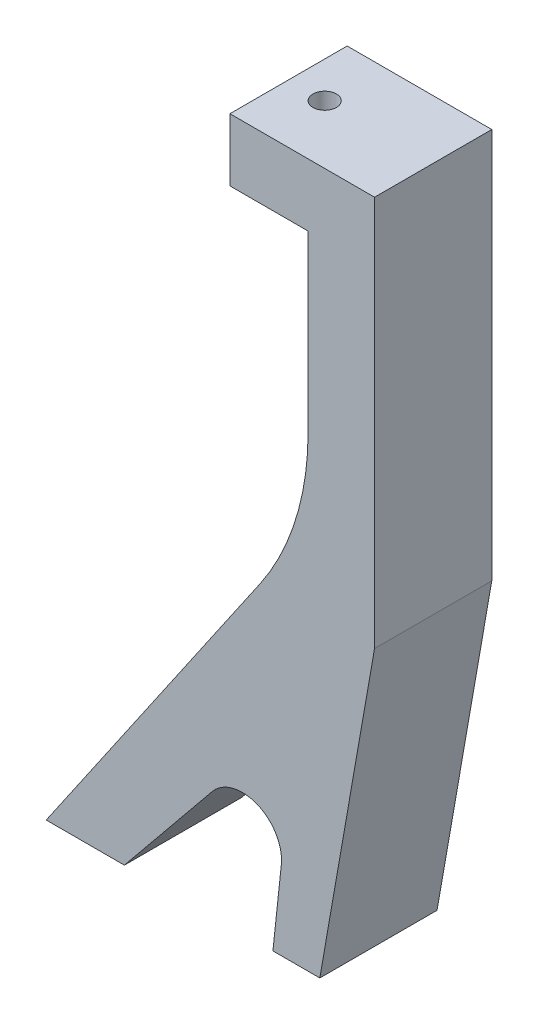
ISO-10303-21;
HEADER;
FILE_DESCRIPTION(('STEP AP214'),'2;1');
FILE_NAME('part.step','',(''),(''),'','','');
FILE_SCHEMA(('AUTOMOTIVE_DESIGN { 1 0 10303 214 1 1 1 1 }'));
ENDSEC;
DATA;
#1=APPLICATION_CONTEXT('core data for automotive mechanical design processes');
#2=APPLICATION_PROTOCOL_DEFINITION('international standard','automotive_design',2000,#1);
#3=PRODUCT_CONTEXT('',#1,'mechanical');
#4=PRODUCT('Part','Part','',(#3));
#5=PRODUCT_RELATED_PRODUCT_CATEGORY('part','',(#4));
#6=PRODUCT_DEFINITION_FORMATION('','',#4);
#7=PRODUCT_DEFINITION_CONTEXT('part definition',#1,'design');
#8=PRODUCT_DEFINITION('design','',#6,#7);
#9=PRODUCT_DEFINITION_SHAPE('','',#8);
#10=(LENGTH_UNIT() NAMED_UNIT(*) SI_UNIT(.MILLI.,.METRE.));
#11=(NAMED_UNIT(*) PLANE_ANGLE_UNIT() SI_UNIT($,.RADIAN.));
#12=(NAMED_UNIT(*) SI_UNIT($,.STERADIAN.) SOLID_ANGLE_UNIT());
#13=UNCERTAINTY_MEASURE_WITH_UNIT(LENGTH_MEASURE(1.E-05),#10,'distance_accuracy_value','');
#14=(GEOMETRIC_REPRESENTATION_CONTEXT(3) GLOBAL_UNCERTAINTY_ASSIGNED_CONTEXT((#13)) GLOBAL_UNIT_ASSIGNED_CONTEXT((#10,
#11,#12)) REPRESENTATION_CONTEXT('',''));
#15=CARTESIAN_POINT('',(0.,0.,0.));
#16=DIRECTION('',(0.,0.,1.));
#17=DIRECTION('',(1.,0.,0.));
#18=AXIS2_PLACEMENT_3D('',#15,#16,#17);
#19=CARTESIAN_POINT('',(-6.5,0.,15.));
#20=DIRECTION('',(1.,0.,0.));
#21=DIRECTION('',(0.,1.,0.));
#22=AXIS2_PLACEMENT_3D('',#19,#20,#21);
#23=PLANE('',#22);
#24=DIRECTION('',(0.,-1.,0.));
#25=VECTOR('',#24,1.);
#26=CARTESIAN_POINT('',(-6.5,0.,0.));
#27=LINE('',#26,#25);
#28=CARTESIAN_POINT('',(-6.5,42.,0.));
#29=VERTEX_POINT('',#28);
#30=CARTESIAN_POINT('',(-6.5,19.6635846093978,0.));
#31=VERTEX_POINT('',#30);
#32=EDGE_CURVE('E161',#29,#31,#27,.T.);
#33=ORIENTED_EDGE('',*,*,#32,.T.);
#34=DIRECTION('',(0.,0.,-1.));
#35=VECTOR('',#34,1.);
#36=CARTESIAN_POINT('',(-6.5,19.6635846093978,15.));
#37=LINE('',#36,#35);
#38=CARTESIAN_POINT('',(-6.5,19.6635846093978,15.));
#39=VERTEX_POINT('',#38);
#40=EDGE_CURVE('E11',#39,#31,#37,.T.);
#41=ORIENTED_EDGE('',*,*,#40,.F.);
#42=DIRECTION('',(0.,-1.,0.));
#43=VECTOR('',#42,1.);
#44=CARTESIAN_POINT('',(-6.5,0.,15.));
#45=LINE('',#44,#43);
#46=CARTESIAN_POINT('',(-6.5,42.,15.));
#47=VERTEX_POINT('',#46);
#48=EDGE_CURVE('E189',#47,#39,#45,.T.);
#49=ORIENTED_EDGE('',*,*,#48,.F.);
#50=DIRECTION('',(0.,0.,-1.));
#51=VECTOR('',#50,1.);
#52=CARTESIAN_POINT('',(-6.5,42.,15.));
#53=LINE('',#52,#51);
#54=EDGE_CURVE('E50',#47,#29,#53,.T.);
#55=ORIENTED_EDGE('',*,*,#54,.T.);
#56=EDGE_LOOP('',(#33,#41,#49,#55));
#57=FACE_BOUND('',#56,.T.);
#58=ADVANCED_FACE('F33',(#57),#23,.F.);
#59=CARTESIAN_POINT('',(-41.5,19.6635846093977,15.));
#60=DIRECTION('',(0.,0.,-1.));
#61=DIRECTION('',(-1.,0.,0.));
#62=AXIS2_PLACEMENT_3D('',#59,#60,#61);
#63=CYLINDRICAL_SURFACE('',#62,35.);
#64=CARTESIAN_POINT('',(-41.5,19.6635846093977,0.));
#65=DIRECTION('',(0.,0.,1.));
#66=DIRECTION('',(1.,0.,0.));
#67=AXIS2_PLACEMENT_3D('',#64,#65,#66);
#68=CIRCLE('',#67,35.);
#69=CARTESIAN_POINT('',(-12.6432773807094,-0.14271639996102,0.));
#70=VERTEX_POINT('',#69);
#71=EDGE_CURVE('E163',#31,#70,#68,.F.);
#72=ORIENTED_EDGE('',*,*,#71,.T.);
#73=DIRECTION('',(0.,0.,-1.));
#74=VECTOR('',#73,1.);
#75=CARTESIAN_POINT('',(-12.6432773807094,-0.14271639996102,15.));
#76=LINE('',#75,#74);
#77=CARTESIAN_POINT('',(-12.6432773807094,-0.14271639996102,15.));
#78=VERTEX_POINT('',#77);
#79=EDGE_CURVE('E42',#78,#70,#76,.T.);
#80=ORIENTED_EDGE('',*,*,#79,.F.);
#81=CARTESIAN_POINT('',(-41.5,19.6635846093977,15.));
#82=DIRECTION('',(0.,0.,1.));
#83=DIRECTION('',(1.,0.,0.));
#84=AXIS2_PLACEMENT_3D('',#81,#82,#83);
#85=CIRCLE('',#84,35.);
#86=EDGE_CURVE('E103',#39,#78,#85,.F.);
#87=ORIENTED_EDGE('',*,*,#86,.F.);
#88=ORIENTED_EDGE('',*,*,#40,.T.);
#89=EDGE_LOOP('',(#72,#80,#87,#88));
#90=FACE_BOUND('',#89,.T.);
#91=ADVANCED_FACE('F219',(#90),#63,.F.);
#92=CARTESIAN_POINT('',(-8.52785325666757,5.8532367238504,15.));
#93=DIRECTION('',(-0.82447778912259,0.565894314553102,0.));
#94=DIRECTION('',(-0.565894314553102,-0.82447778912259,0.));
#95=AXIS2_PLACEMENT_3D('',#92,#93,#94);
#96=PLANE('',#95);
#97=DIRECTION('',(0.565894314553102,0.824477789122591,0.));
#98=VECTOR('',#97,1.);
#99=CARTESIAN_POINT('',(-8.52785325666757,5.8532367238504,0.));
#100=LINE('',#99,#98);
#101=CARTESIAN_POINT('',(-40.,-40.,0.));
#102=VERTEX_POINT('',#101);
#103=EDGE_CURVE('E166',#102,#70,#100,.T.);
#104=ORIENTED_EDGE('',*,*,#103,.F.);
#105=DIRECTION('',(0.,0.,-1.));
#106=VECTOR('',#105,1.);
#107=CARTESIAN_POINT('',(-40.,-40.,15.));
#108=LINE('',#107,#106);
#109=CARTESIAN_POINT('',(-40.,-40.,15.));
#110=VERTEX_POINT('',#109);
#111=EDGE_CURVE('E211',#110,#102,#108,.T.);
#112=ORIENTED_EDGE('',*,*,#111,.F.);
#113=DIRECTION('',(0.565894314553102,0.824477789122591,0.));
#114=VECTOR('',#113,1.);
#115=CARTESIAN_POINT('',(-8.52785325666757,5.8532367238504,15.));
#116=LINE('',#115,#114);
#117=EDGE_CURVE('E218',#110,#78,#116,.T.);
#118=ORIENTED_EDGE('',*,*,#117,.T.);
#119=ORIENTED_EDGE('',*,*,#79,.T.);
#120=EDGE_LOOP('',(#104,#112,#118,#119));
#121=FACE_BOUND('',#120,.T.);
#122=ADVANCED_FACE('F216',(#121),#96,.T.);
#123=CARTESIAN_POINT('',(0.,-40.,15.));
#124=DIRECTION('',(0.,1.,0.));
#125=DIRECTION('',(0.,0.,1.));
#126=AXIS2_PLACEMENT_3D('',#123,#124,#125);
#127=PLANE('',#126);
#128=DIRECTION('',(1.,0.,0.));
#129=VECTOR('',#128,1.);
#130=CARTESIAN_POINT('',(0.,-40.,0.));
#131=LINE('',#130,#129);
#132=CARTESIAN_POINT('',(-30.,-40.,0.));
#133=VERTEX_POINT('',#132);
#134=EDGE_CURVE('E169',#102,#133,#131,.T.);
#135=ORIENTED_EDGE('',*,*,#134,.T.);
#136=DIRECTION('',(0.,0.,-1.));
#137=VECTOR('',#136,1.);
#138=CARTESIAN_POINT('',(-30.,-40.,15.));
#139=LINE('',#138,#137);
#140=CARTESIAN_POINT('',(-30.,-40.,15.));
#141=VERTEX_POINT('',#140);
#142=EDGE_CURVE('E208',#141,#133,#139,.T.);
#143=ORIENTED_EDGE('',*,*,#142,.F.);
#144=DIRECTION('',(1.,0.,0.));
#145=VECTOR('',#144,1.);
#146=CARTESIAN_POINT('',(0.,-40.,15.));
#147=LINE('',#146,#145);
#148=EDGE_CURVE('E237',#110,#141,#147,.T.);
#149=ORIENTED_EDGE('',*,*,#148,.F.);
#150=ORIENTED_EDGE('',*,*,#111,.T.);
#151=EDGE_LOOP('',(#135,#143,#149,#150));
#152=FACE_BOUND('',#151,.T.);
#153=ADVANCED_FACE('F228',(#152),#127,.F.);
#154=CARTESIAN_POINT('',(1.57446256526328,-1.28403914642141,15.));
#155=DIRECTION('',(-0.774959239492051,0.632011215981094,0.));
#156=DIRECTION('',(-0.632011215981094,-0.774959239492051,0.));
#157=AXIS2_PLACEMENT_3D('',#154,#155,#156);
#158=PLANE('',#157);
#159=DIRECTION('',(0.632011215981094,0.774959239492051,0.));
#160=VECTOR('',#159,1.);
#161=CARTESIAN_POINT('',(1.57446256526328,-1.28403914642141,0.));
#162=LINE('',#161,#160);
#163=CARTESIAN_POINT('',(-18.7725196071444,-26.2330929473259,0.));
#164=VERTEX_POINT('',#163);
#165=EDGE_CURVE('E171',#133,#164,#162,.T.);
#166=ORIENTED_EDGE('',*,*,#165,.T.);
#167=DIRECTION('',(0.,0.,-1.));
#168=VECTOR('',#167,1.);
#169=CARTESIAN_POINT('',(-18.7725196071444,-26.2330929473259,15.));
#170=LINE('',#169,#168);
#171=CARTESIAN_POINT('',(-18.7725196071444,-26.2330929473259,15.));
#172=VERTEX_POINT('',#171);
#173=EDGE_CURVE('E205',#172,#164,#170,.T.);
#174=ORIENTED_EDGE('',*,*,#173,.F.);
#175=DIRECTION('',(0.632011215981094,0.774959239492051,0.));
#176=VECTOR('',#175,1.);
#177=CARTESIAN_POINT('',(1.57446256526328,-1.28403914642141,15.));
#178=LINE('',#177,#176);
#179=EDGE_CURVE('E234',#141,#172,#178,.T.);
#180=ORIENTED_EDGE('',*,*,#179,.F.);
#181=ORIENTED_EDGE('',*,*,#142,.T.);
#182=EDGE_LOOP('',(#166,#174,#180,#181));
#183=FACE_BOUND('',#182,.T.);
#184=ADVANCED_FACE('F232',(#183),#158,.F.);
#185=CARTESIAN_POINT('',(-14.8977234096841,-29.3931490272312,15.));
#186=DIRECTION('',(0.,0.,-1.));
#187=DIRECTION('',(-1.,0.,0.));
#188=AXIS2_PLACEMENT_3D('',#185,#186,#187);
#189=CYLINDRICAL_SURFACE('',#188,5.);
#190=CARTESIAN_POINT('',(-14.8977234096841,-29.3931490272312,0.));
#191=DIRECTION('',(0.,0.,1.));
#192=DIRECTION('',(1.,0.,0.));
#193=AXIS2_PLACEMENT_3D('',#190,#191,#192);
#194=CIRCLE('',#193,5.);
#195=CARTESIAN_POINT('',(-9.925888036134,-29.9231047030347,0.));
#196=VERTEX_POINT('',#195);
#197=EDGE_CURVE('E173',#164,#196,#194,.F.);
#198=ORIENTED_EDGE('',*,*,#197,.T.);
#199=DIRECTION('',(0.,0.,-1.));
#200=VECTOR('',#199,1.);
#201=CARTESIAN_POINT('',(-9.925888036134,-29.9231047030347,15.));
#202=LINE('',#201,#200);
#203=CARTESIAN_POINT('',(-9.925888036134,-29.9231047030347,15.));
#204=VERTEX_POINT('',#203);
#205=EDGE_CURVE('E202',#204,#196,#202,.T.);
#206=ORIENTED_EDGE('',*,*,#205,.F.);
#207=CARTESIAN_POINT('',(-14.8977234096841,-29.3931490272312,15.));
#208=DIRECTION('',(0.,0.,1.));
#209=DIRECTION('',(1.,0.,0.));
#210=AXIS2_PLACEMENT_3D('',#207,#208,#209);
#211=CIRCLE('',#210,5.);
#212=EDGE_CURVE('E236',#172,#204,#211,.F.);
#213=ORIENTED_EDGE('',*,*,#212,.F.);
#214=ORIENTED_EDGE('',*,*,#173,.T.);
#215=EDGE_LOOP('',(#198,#206,#213,#214));
#216=FACE_BOUND('',#215,.T.);
#217=ADVANCED_FACE('F344',(#216),#189,.F.);
#218=CARTESIAN_POINT('',(-6.66066087134491,0.709970215858082,15.));
#219=DIRECTION('',(0.994367074710016,-0.10599113516066,0.));
#220=DIRECTION('',(0.10599113516066,0.994367074710016,0.));
#221=AXIS2_PLACEMENT_3D('',#218,#219,#220);
#222=PLANE('',#221);
#223=DIRECTION('',(-0.10599113516066,-0.994367074710016,0.));
#224=VECTOR('',#223,1.);
#225=CARTESIAN_POINT('',(-6.66066087134491,0.709970215858082,0.));
#226=LINE('',#225,#224);
#227=CARTESIAN_POINT('',(-11.,-40.,0.));
#228=VERTEX_POINT('',#227);
#229=EDGE_CURVE('E175',#196,#228,#226,.T.);
#230=ORIENTED_EDGE('',*,*,#229,.T.);
#231=DIRECTION('',(0.,0.,-1.));
#232=VECTOR('',#231,1.);
#233=CARTESIAN_POINT('',(-11.,-40.,15.));
#234=LINE('',#233,#232);
#235=CARTESIAN_POINT('',(-11.,-40.,15.));
#236=VERTEX_POINT('',#235);
#237=EDGE_CURVE('E199',#236,#228,#234,.T.);
#238=ORIENTED_EDGE('',*,*,#237,.F.);
#239=DIRECTION('',(-0.10599113516066,-0.994367074710016,0.));
#240=VECTOR('',#239,1.);
#241=CARTESIAN_POINT('',(-6.66066087134491,0.709970215858082,15.));
#242=LINE('',#241,#240);
#243=EDGE_CURVE('E239',#204,#236,#242,.T.);
#244=ORIENTED_EDGE('',*,*,#243,.F.);
#245=ORIENTED_EDGE('',*,*,#205,.T.);
#246=EDGE_LOOP('',(#230,#238,#244,#245));
#247=FACE_BOUND('',#246,.T.);
#248=ADVANCED_FACE('F334',(#247),#222,.F.);
#249=CARTESIAN_POINT('',(0.,-40.,15.));
#250=DIRECTION('',(0.,1.,0.));
#251=DIRECTION('',(-1.,0.,0.));
#252=AXIS2_PLACEMENT_3D('',#249,#250,#251);
#253=PLANE('',#252);
#254=DIRECTION('',(1.,0.,0.));
#255=VECTOR('',#254,1.);
#256=CARTESIAN_POINT('',(0.,-40.,0.));
#257=LINE('',#256,#255);
#258=CARTESIAN_POINT('',(-5.,-40.,0.));
#259=VERTEX_POINT('',#258);
#260=EDGE_CURVE('E177',#228,#259,#257,.T.);
#261=ORIENTED_EDGE('',*,*,#260,.T.);
#262=DIRECTION('',(0.,0.,-1.));
#263=VECTOR('',#262,1.);
#264=CARTESIAN_POINT('',(-5.,-40.,15.));
#265=LINE('',#264,#263);
#266=CARTESIAN_POINT('',(-5.,-40.,15.));
#267=VERTEX_POINT('',#266);
#268=EDGE_CURVE('E196',#267,#259,#265,.T.);
#269=ORIENTED_EDGE('',*,*,#268,.F.);
#270=DIRECTION('',(1.,0.,0.));
#271=VECTOR('',#270,1.);
#272=CARTESIAN_POINT('',(0.,-40.,15.));
#273=LINE('',#272,#271);
#274=EDGE_CURVE('E245',#236,#267,#273,.T.);
#275=ORIENTED_EDGE('',*,*,#274,.F.);
#276=ORIENTED_EDGE('',*,*,#237,.T.);
#277=EDGE_LOOP('',(#261,#269,#275,#276));
#278=FACE_BOUND('',#277,.T.);
#279=ADVANCED_FACE('F325',(#278),#253,.F.);
#280=CARTESIAN_POINT('',(1.94057004244997,-0.339599757428745,15.));
#281=DIRECTION('',(-0.985030467155704,0.172380331752248,0.));
#282=DIRECTION('',(-0.172380331752248,-0.985030467155704,0.));
#283=AXIS2_PLACEMENT_3D('',#280,#281,#282);
#284=PLANE('',#283);
#285=DIRECTION('',(0.172380331752248,0.985030467155704,0.));
#286=VECTOR('',#285,1.);
#287=CARTESIAN_POINT('',(1.94057004244997,-0.339599757428745,0.));
#288=LINE('',#287,#286);
#289=CARTESIAN_POINT('',(2.,0.,0.));
#290=VERTEX_POINT('',#289);
#291=EDGE_CURVE('E179',#259,#290,#288,.T.);
#292=ORIENTED_EDGE('',*,*,#291,.T.);
#293=DIRECTION('',(0.,0.,-1.));
#294=VECTOR('',#293,1.);
#295=CARTESIAN_POINT('',(2.,0.,15.));
#296=LINE('',#295,#294);
#297=CARTESIAN_POINT('',(2.,0.,15.));
#298=VERTEX_POINT('',#297);
#299=EDGE_CURVE('E193',#298,#290,#296,.T.);
#300=ORIENTED_EDGE('',*,*,#299,.F.);
#301=DIRECTION('',(0.172380331752248,0.985030467155704,0.));
#302=VECTOR('',#301,1.);
#303=CARTESIAN_POINT('',(1.94057004244997,-0.339599757428745,15.));
#304=LINE('',#303,#302);
#305=EDGE_CURVE('E247',#267,#298,#304,.T.);
#306=ORIENTED_EDGE('',*,*,#305,.F.);
#307=ORIENTED_EDGE('',*,*,#268,.T.);
#308=EDGE_LOOP('',(#292,#300,#306,#307));
#309=FACE_BOUND('',#308,.T.);
#310=ADVANCED_FACE('F253',(#309),#284,.F.);
#311=CARTESIAN_POINT('',(2.,0.,15.));
#312=DIRECTION('',(-1.,0.,0.));
#313=DIRECTION('',(0.,0.,1.));
#314=AXIS2_PLACEMENT_3D('',#311,#312,#313);
#315=PLANE('',#314);
#316=DIRECTION('',(0.,1.,0.));
#317=VECTOR('',#316,1.);
#318=CARTESIAN_POINT('',(2.,0.,0.));
#319=LINE('',#318,#317);
#320=CARTESIAN_POINT('',(2.,50.,0.));
#321=VERTEX_POINT('',#320);
#322=EDGE_CURVE('E181',#290,#321,#319,.T.);
#323=ORIENTED_EDGE('',*,*,#322,.T.);
#324=DIRECTION('',(0.,0.,-1.));
#325=VECTOR('',#324,1.);
#326=CARTESIAN_POINT('',(2.,50.,15.));
#327=LINE('',#326,#325);
#328=CARTESIAN_POINT('',(2.,50.,15.));
#329=VERTEX_POINT('',#328);
#330=EDGE_CURVE('E153',#329,#321,#327,.T.);
#331=ORIENTED_EDGE('',*,*,#330,.F.);
#332=DIRECTION('',(0.,1.,0.));
#333=VECTOR('',#332,1.);
#334=CARTESIAN_POINT('',(2.,0.,15.));
#335=LINE('',#334,#333);
#336=EDGE_CURVE('E141',#298,#329,#335,.T.);
#337=ORIENTED_EDGE('',*,*,#336,.F.);
#338=ORIENTED_EDGE('',*,*,#299,.T.);
#339=EDGE_LOOP('',(#323,#331,#337,#338));
#340=FACE_BOUND('',#339,.T.);
#341=ADVANCED_FACE('F257',(#340),#315,.F.);
#342=CARTESIAN_POINT('',(0.,50.,15.));
#343=DIRECTION('',(0.,-1.,0.));
#344=DIRECTION('',(0.,0.,-1.));
#345=AXIS2_PLACEMENT_3D('',#342,#343,#344);
#346=PLANE('',#345);
#347=CARTESIAN_POINT('',(-11.875,50.,7.5));
#348=DIRECTION('',(0.,1.,0.));
#349=DIRECTION('',(0.,0.,1.));
#350=AXIS2_PLACEMENT_3D('',#347,#348,#349);
#351=CIRCLE('',#350,1.5);
#352=CARTESIAN_POINT('',(-11.875,50.,9.));
#353=VERTEX_POINT('',#352);
#354=EDGE_CURVE('E277',#353,#353,#351,.T.);
#355=ORIENTED_EDGE('',*,*,#354,.F.);
#356=EDGE_LOOP('',(#355));
#357=FACE_BOUND('',#356,.T.);
#358=DIRECTION('',(-1.,0.,0.));
#359=VECTOR('',#358,1.);
#360=CARTESIAN_POINT('',(0.,50.,0.));
#361=LINE('',#360,#359);
#362=CARTESIAN_POINT('',(-16.5,50.,0.));
#363=VERTEX_POINT('',#362);
#364=EDGE_CURVE('E150',#321,#363,#361,.T.);
#365=ORIENTED_EDGE('',*,*,#364,.T.);
#366=DIRECTION('',(0.,0.,-1.));
#367=VECTOR('',#366,1.);
#368=CARTESIAN_POINT('',(-16.5,50.,15.));
#369=LINE('',#368,#367);
#370=CARTESIAN_POINT('',(-16.5,50.,15.));
#371=VERTEX_POINT('',#370);
#372=EDGE_CURVE('E147',#371,#363,#369,.T.);
#373=ORIENTED_EDGE('',*,*,#372,.F.);
#374=DIRECTION('',(-1.,0.,0.));
#375=VECTOR('',#374,1.);
#376=CARTESIAN_POINT('',(0.,50.,15.));
#377=LINE('',#376,#375);
#378=EDGE_CURVE('E134',#329,#371,#377,.T.);
#379=ORIENTED_EDGE('',*,*,#378,.F.);
#380=ORIENTED_EDGE('',*,*,#330,.T.);
#381=EDGE_LOOP('',(#365,#373,#379,#380));
#382=FACE_BOUND('',#381,.T.);
#383=ADVANCED_FACE('F148',(#357,#382),#346,.F.);
#384=CARTESIAN_POINT('',(-16.5,0.,15.));
#385=DIRECTION('',(-1.,0.,0.));
#386=DIRECTION('',(0.,0.,1.));
#387=AXIS2_PLACEMENT_3D('',#384,#385,#386);
#388=PLANE('',#387);
#389=DIRECTION('',(0.,1.,0.));
#390=VECTOR('',#389,1.);
#391=CARTESIAN_POINT('',(-16.5,0.,0.));
#392=LINE('',#391,#390);
#393=CARTESIAN_POINT('',(-16.5,42.,0.));
#394=VERTEX_POINT('',#393);
#395=EDGE_CURVE('E184',#394,#363,#392,.T.);
#396=ORIENTED_EDGE('',*,*,#395,.F.);
#397=DIRECTION('',(0.,0.,-1.));
#398=VECTOR('',#397,1.);
#399=CARTESIAN_POINT('',(-16.5,42.,15.));
#400=LINE('',#399,#398);
#401=CARTESIAN_POINT('',(-16.5,42.,15.));
#402=VERTEX_POINT('',#401);
#403=EDGE_CURVE('E91',#402,#394,#400,.T.);
#404=ORIENTED_EDGE('',*,*,#403,.F.);
#405=DIRECTION('',(0.,1.,0.));
#406=VECTOR('',#405,1.);
#407=CARTESIAN_POINT('',(-16.5,0.,15.));
#408=LINE('',#407,#406);
#409=EDGE_CURVE('E139',#402,#371,#408,.T.);
#410=ORIENTED_EDGE('',*,*,#409,.T.);
#411=ORIENTED_EDGE('',*,*,#372,.T.);
#412=EDGE_LOOP('',(#396,#404,#410,#411));
#413=FACE_BOUND('',#412,.T.);
#414=ADVANCED_FACE('F155',(#413),#388,.T.);
#415=CARTESIAN_POINT('',(0.,42.,15.));
#416=DIRECTION('',(0.,-1.,0.));
#417=DIRECTION('',(0.,0.,-1.));
#418=AXIS2_PLACEMENT_3D('',#415,#416,#417);
#419=PLANE('',#418);
#420=CARTESIAN_POINT('',(-11.875,42.,7.5));
#421=DIRECTION('',(0.,-1.,0.));
#422=DIRECTION('',(0.,0.,-1.));
#423=AXIS2_PLACEMENT_3D('',#420,#421,#422);
#424=CIRCLE('',#423,1.5);
#425=CARTESIAN_POINT('',(-11.875,42.,6.));
#426=VERTEX_POINT('',#425);
#427=EDGE_CURVE('E36',#426,#426,#424,.T.);
#428=ORIENTED_EDGE('',*,*,#427,.F.);
#429=EDGE_LOOP('',(#428));
#430=FACE_BOUND('',#429,.T.);
#431=DIRECTION('',(-1.,0.,0.));
#432=VECTOR('',#431,1.);
#433=CARTESIAN_POINT('',(0.,42.,0.));
#434=LINE('',#433,#432);
#435=EDGE_CURVE('E186',#29,#394,#434,.T.);
#436=ORIENTED_EDGE('',*,*,#435,.F.);
#437=ORIENTED_EDGE('',*,*,#54,.F.);
#438=DIRECTION('',(-1.,0.,0.));
#439=VECTOR('',#438,1.);
#440=CARTESIAN_POINT('',(0.,42.,15.));
#441=LINE('',#440,#439);
#442=EDGE_CURVE('E156',#47,#402,#441,.T.);
#443=ORIENTED_EDGE('',*,*,#442,.T.);
#444=ORIENTED_EDGE('',*,*,#403,.T.);
#445=EDGE_LOOP('',(#436,#437,#443,#444));
#446=FACE_BOUND('',#445,.T.);
#447=ADVANCED_FACE('F258',(#430,#446),#419,.T.);
#448=CARTESIAN_POINT('',(0.,0.,15.));
#449=DIRECTION('',(0.,0.,1.));
#450=DIRECTION('',(1.,0.,0.));
#451=AXIS2_PLACEMENT_3D('',#448,#449,#450);
#452=PLANE('',#451);
#453=ORIENTED_EDGE('',*,*,#48,.T.);
#454=ORIENTED_EDGE('',*,*,#86,.T.);
#455=ORIENTED_EDGE('',*,*,#117,.F.);
#456=ORIENTED_EDGE('',*,*,#148,.T.);
#457=ORIENTED_EDGE('',*,*,#179,.T.);
#458=ORIENTED_EDGE('',*,*,#212,.T.);
#459=ORIENTED_EDGE('',*,*,#243,.T.);
#460=ORIENTED_EDGE('',*,*,#274,.T.);
#461=ORIENTED_EDGE('',*,*,#305,.T.);
#462=ORIENTED_EDGE('',*,*,#336,.T.);
#463=ORIENTED_EDGE('',*,*,#378,.T.);
#464=ORIENTED_EDGE('',*,*,#409,.F.);
#465=ORIENTED_EDGE('',*,*,#442,.F.);
#466=EDGE_LOOP('',(#453,#454,#455,#456,#457,#458,#459,#460,#461,#462,#463,#464,#465));
#467=FACE_BOUND('',#466,.T.);
#468=ADVANCED_FACE('F136',(#467),#452,.T.);
#469=CARTESIAN_POINT('',(0.,0.,0.));
#470=DIRECTION('',(0.,0.,1.));
#471=DIRECTION('',(1.,0.,0.));
#472=AXIS2_PLACEMENT_3D('',#469,#470,#471);
#473=PLANE('',#472);
#474=ORIENTED_EDGE('',*,*,#32,.F.);
#475=ORIENTED_EDGE('',*,*,#435,.T.);
#476=ORIENTED_EDGE('',*,*,#395,.T.);
#477=ORIENTED_EDGE('',*,*,#364,.F.);
#478=ORIENTED_EDGE('',*,*,#322,.F.);
#479=ORIENTED_EDGE('',*,*,#291,.F.);
#480=ORIENTED_EDGE('',*,*,#260,.F.);
#481=ORIENTED_EDGE('',*,*,#229,.F.);
#482=ORIENTED_EDGE('',*,*,#197,.F.);
#483=ORIENTED_EDGE('',*,*,#165,.F.);
#484=ORIENTED_EDGE('',*,*,#134,.F.);
#485=ORIENTED_EDGE('',*,*,#103,.T.);
#486=ORIENTED_EDGE('',*,*,#71,.F.);
#487=EDGE_LOOP('',(#474,#475,#476,#477,#478,#479,#480,#481,#482,#483,#484,#485,#486));
#488=FACE_BOUND('',#487,.T.);
#489=ADVANCED_FACE('F223',(#488),#473,.F.);
#490=CARTESIAN_POINT('',(-11.875,35.,7.5));
#491=DIRECTION('',(0.,1.,0.));
#492=DIRECTION('',(0.,0.,1.));
#493=AXIS2_PLACEMENT_3D('',#490,#491,#492);
#494=CYLINDRICAL_SURFACE('',#493,1.5);
#495=ORIENTED_EDGE('',*,*,#427,.T.);
#496=EDGE_LOOP('',(#495));
#497=FACE_BOUND('',#496,.T.);
#498=ORIENTED_EDGE('',*,*,#354,.T.);
#499=EDGE_LOOP('',(#498));
#500=FACE_BOUND('',#499,.T.);
#501=ADVANCED_FACE('F283',(#497,#500),#494,.F.);
#502=CLOSED_SHELL('',(#58,#91,#122,#153,#184,#217,#248,#279,#310,#341,#383,#414,#447,#468,#489,#501));
#503=MANIFOLD_SOLID_BREP('B2',#502);
#504=ADVANCED_BREP_SHAPE_REPRESENTATION('',(#18,#503),#14);
#505=SHAPE_DEFINITION_REPRESENTATION(#9,#504);
ENDSEC;
END-ISO-10303-21;
